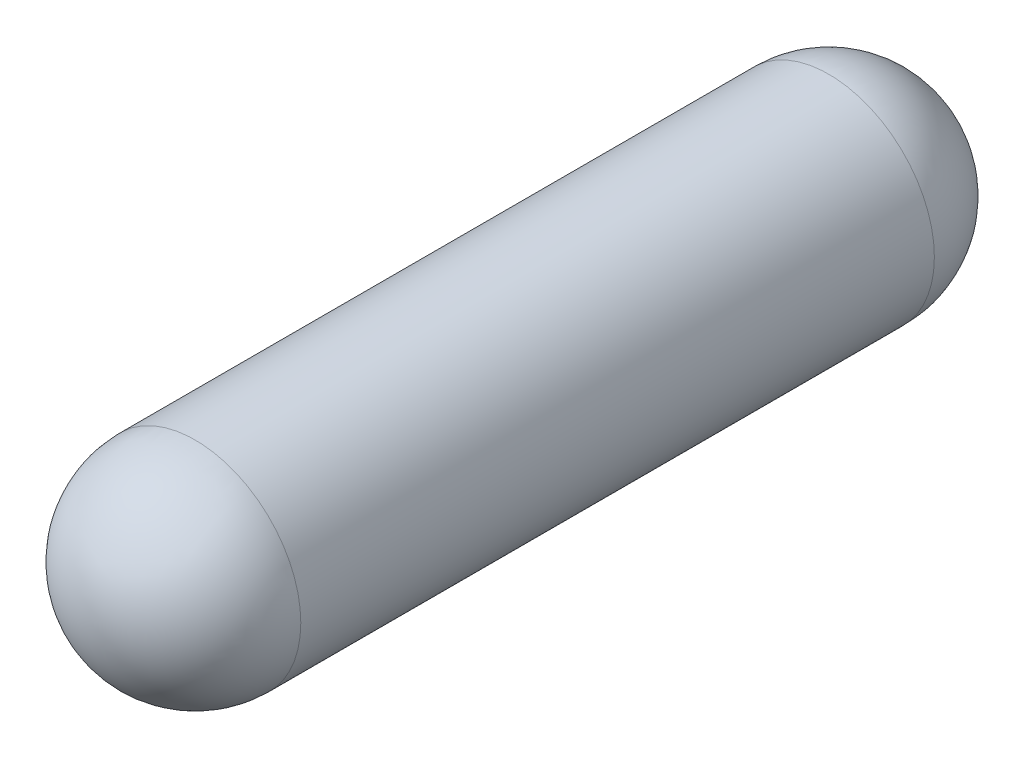
ISO-10303-21;
HEADER;
FILE_DESCRIPTION(('STEP AP214'),'2;1');
FILE_NAME('part.step','',(''),(''),'','','');
FILE_SCHEMA(('AUTOMOTIVE_DESIGN { 1 0 10303 214 1 1 1 1 }'));
ENDSEC;
DATA;
#1=APPLICATION_CONTEXT('core data for automotive mechanical design processes');
#2=APPLICATION_PROTOCOL_DEFINITION('international standard','automotive_design',2000,#1);
#3=PRODUCT_CONTEXT('',#1,'mechanical');
#4=PRODUCT('Part','Part','',(#3));
#5=PRODUCT_RELATED_PRODUCT_CATEGORY('part','',(#4));
#6=PRODUCT_DEFINITION_FORMATION('','',#4);
#7=PRODUCT_DEFINITION_CONTEXT('part definition',#1,'design');
#8=PRODUCT_DEFINITION('design','',#6,#7);
#9=PRODUCT_DEFINITION_SHAPE('','',#8);
#10=(LENGTH_UNIT() NAMED_UNIT(*) SI_UNIT(.MILLI.,.METRE.));
#11=(NAMED_UNIT(*) PLANE_ANGLE_UNIT() SI_UNIT($,.RADIAN.));
#12=(NAMED_UNIT(*) SI_UNIT($,.STERADIAN.) SOLID_ANGLE_UNIT());
#13=UNCERTAINTY_MEASURE_WITH_UNIT(LENGTH_MEASURE(1.E-05),#10,'distance_accuracy_value','');
#14=(GEOMETRIC_REPRESENTATION_CONTEXT(3) GLOBAL_UNCERTAINTY_ASSIGNED_CONTEXT((#13)) GLOBAL_UNIT_ASSIGNED_CONTEXT((#10,
#11,#12)) REPRESENTATION_CONTEXT('',''));
#15=CARTESIAN_POINT('',(0.,0.,0.));
#16=DIRECTION('',(0.,0.,1.));
#17=DIRECTION('',(1.,0.,0.));
#18=AXIS2_PLACEMENT_3D('',#15,#16,#17);
#19=CARTESIAN_POINT('',(6.,0.,-3.));
#20=DIRECTION('',(1.,0.,0.));
#21=DIRECTION('',(0.,-1.,0.));
#22=AXIS2_PLACEMENT_3D('',#19,#20,#21);
#23=SPHERICAL_SURFACE('',#22,1.5);
#24=CARTESIAN_POINT('',(6.,0.,-3.));
#25=DIRECTION('',(0.,0.,1.));
#26=DIRECTION('',(1.,0.,0.));
#27=AXIS2_PLACEMENT_3D('',#24,#25,#26);
#28=CIRCLE('',#27,1.5);
#29=CARTESIAN_POINT('',(7.5,0.,-3.));
#30=VERTEX_POINT('',#29);
#31=CARTESIAN_POINT('',(4.5,0.,-3.));
#32=VERTEX_POINT('',#31);
#33=EDGE_CURVE('E42',#30,#32,#28,.T.);
#34=ORIENTED_EDGE('',*,*,#33,.F.);
#35=CARTESIAN_POINT('',(6.,0.,-3.));
#36=DIRECTION('',(0.,0.,1.));
#37=DIRECTION('',(1.,0.,0.));
#38=AXIS2_PLACEMENT_3D('',#35,#36,#37);
#39=CIRCLE('',#38,1.5);
#40=EDGE_CURVE('E26',#32,#30,#39,.T.);
#41=ORIENTED_EDGE('',*,*,#40,.F.);
#42=EDGE_LOOP('',(#34,#41));
#43=FACE_BOUND('',#42,.T.);
#44=ADVANCED_FACE('F17',(#43),#23,.T.);
#45=CARTESIAN_POINT('',(6.,0.,6.));
#46=DIRECTION('',(1.,0.,0.));
#47=DIRECTION('',(0.,1.,0.));
#48=AXIS2_PLACEMENT_3D('',#45,#46,#47);
#49=SPHERICAL_SURFACE('',#48,1.5);
#50=CARTESIAN_POINT('',(6.,0.,6.));
#51=DIRECTION('',(0.,0.,1.));
#52=DIRECTION('',(1.,0.,0.));
#53=AXIS2_PLACEMENT_3D('',#50,#51,#52);
#54=CIRCLE('',#53,1.5);
#55=CARTESIAN_POINT('',(7.5,0.,6.));
#56=VERTEX_POINT('',#55);
#57=CARTESIAN_POINT('',(4.5,0.,6.));
#58=VERTEX_POINT('',#57);
#59=EDGE_CURVE('E11',#56,#58,#54,.F.);
#60=ORIENTED_EDGE('',*,*,#59,.F.);
#61=CARTESIAN_POINT('',(6.,0.,6.));
#62=DIRECTION('',(0.,0.,1.));
#63=DIRECTION('',(1.,0.,0.));
#64=AXIS2_PLACEMENT_3D('',#61,#62,#63);
#65=CIRCLE('',#64,1.5);
#66=EDGE_CURVE('E34',#58,#56,#65,.F.);
#67=ORIENTED_EDGE('',*,*,#66,.F.);
#68=EDGE_LOOP('',(#60,#67));
#69=FACE_BOUND('',#68,.T.);
#70=ADVANCED_FACE('F49',(#69),#49,.T.);
#71=CARTESIAN_POINT('',(6.,0.,-3.));
#72=DIRECTION('',(0.,0.,1.));
#73=DIRECTION('',(1.,0.,0.));
#74=AXIS2_PLACEMENT_3D('',#71,#72,#73);
#75=CYLINDRICAL_SURFACE('',#74,1.5);
#76=ORIENTED_EDGE('',*,*,#66,.T.);
#77=ORIENTED_EDGE('',*,*,#59,.T.);
#78=EDGE_LOOP('',(#76,#77));
#79=FACE_BOUND('',#78,.T.);
#80=ORIENTED_EDGE('',*,*,#40,.T.);
#81=ORIENTED_EDGE('',*,*,#33,.T.);
#82=EDGE_LOOP('',(#80,#81));
#83=FACE_BOUND('',#82,.T.);
#84=ADVANCED_FACE('F45',(#79,#83),#75,.T.);
#85=CLOSED_SHELL('',(#44,#70,#84));
#86=MANIFOLD_SOLID_BREP('B1',#85);
#87=ADVANCED_BREP_SHAPE_REPRESENTATION('',(#18,#86),#14);
#88=SHAPE_DEFINITION_REPRESENTATION(#9,#87);
ENDSEC;
END-ISO-10303-21;
